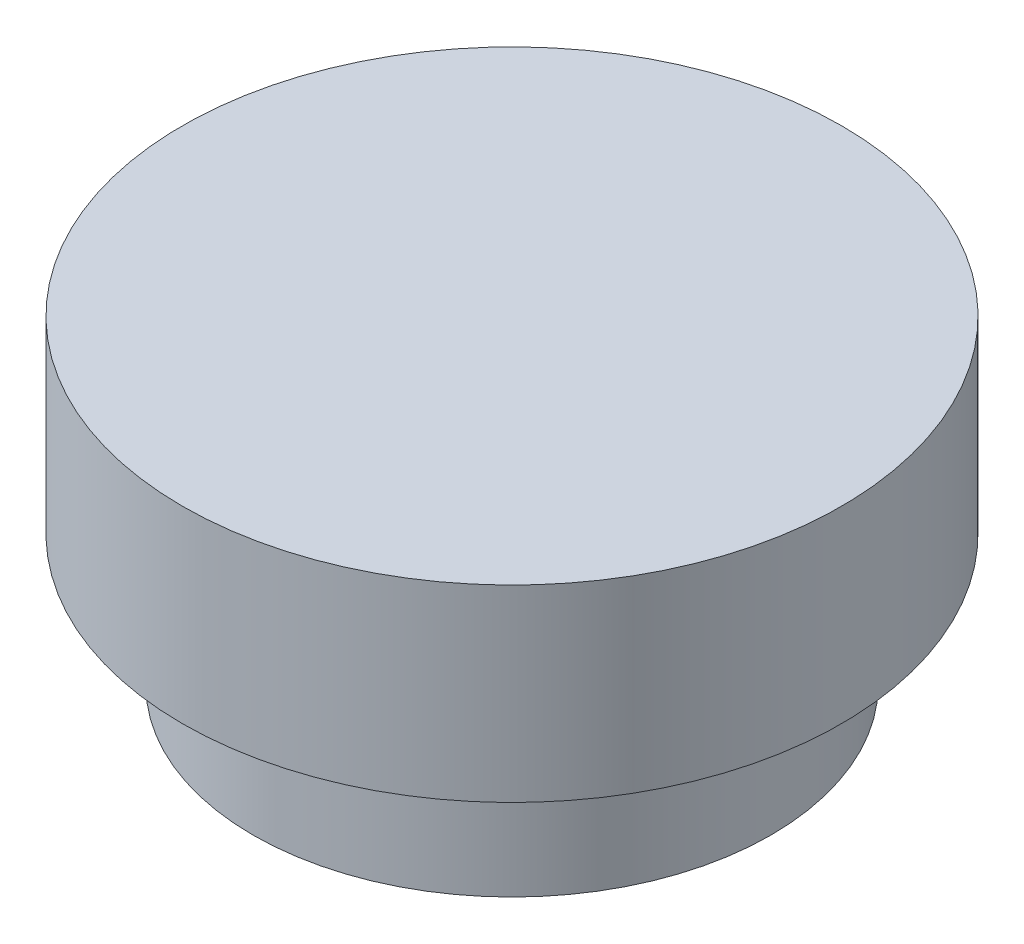
ISO-10303-21;
HEADER;
FILE_DESCRIPTION(('STEP AP214'),'2;1');
FILE_NAME('part.step','',(''),(''),'','','');
FILE_SCHEMA(('AUTOMOTIVE_DESIGN { 1 0 10303 214 1 1 1 1 }'));
ENDSEC;
DATA;
#1=APPLICATION_CONTEXT('core data for automotive mechanical design processes');
#2=APPLICATION_PROTOCOL_DEFINITION('international standard','automotive_design',2000,#1);
#3=PRODUCT_CONTEXT('',#1,'mechanical');
#4=PRODUCT('Part','Part','',(#3));
#5=PRODUCT_RELATED_PRODUCT_CATEGORY('part','',(#4));
#6=PRODUCT_DEFINITION_FORMATION('','',#4);
#7=PRODUCT_DEFINITION_CONTEXT('part definition',#1,'design');
#8=PRODUCT_DEFINITION('design','',#6,#7);
#9=PRODUCT_DEFINITION_SHAPE('','',#8);
#10=(LENGTH_UNIT() NAMED_UNIT(*) SI_UNIT(.MILLI.,.METRE.));
#11=(NAMED_UNIT(*) PLANE_ANGLE_UNIT() SI_UNIT($,.RADIAN.));
#12=(NAMED_UNIT(*) SI_UNIT($,.STERADIAN.) SOLID_ANGLE_UNIT());
#13=UNCERTAINTY_MEASURE_WITH_UNIT(LENGTH_MEASURE(1.E-05),#10,'distance_accuracy_value','');
#14=(GEOMETRIC_REPRESENTATION_CONTEXT(3) GLOBAL_UNCERTAINTY_ASSIGNED_CONTEXT((#13)) GLOBAL_UNIT_ASSIGNED_CONTEXT((#10,
#11,#12)) REPRESENTATION_CONTEXT('',''));
#15=CARTESIAN_POINT('',(0.,0.,0.));
#16=DIRECTION('',(0.,0.,1.));
#17=DIRECTION('',(1.,0.,0.));
#18=AXIS2_PLACEMENT_3D('',#15,#16,#17);
#19=CARTESIAN_POINT('',(0.,2.5,0.));
#20=DIRECTION('',(0.,-1.,0.));
#21=DIRECTION('',(0.,0.,-1.));
#22=AXIS2_PLACEMENT_3D('',#19,#20,#21);
#23=CYLINDRICAL_SURFACE('',#22,1.25);
#24=CARTESIAN_POINT('',(0.,2.5,0.));
#25=DIRECTION('',(0.,1.,0.));
#26=DIRECTION('',(0.,0.,1.));
#27=AXIS2_PLACEMENT_3D('',#24,#25,#26);
#28=CIRCLE('',#27,1.25);
#29=CARTESIAN_POINT('',(0.,2.5,1.25));
#30=VERTEX_POINT('',#29);
#31=EDGE_CURVE('E10',#30,#30,#28,.T.);
#32=ORIENTED_EDGE('',*,*,#31,.F.);
#33=EDGE_LOOP('',(#32));
#34=FACE_BOUND('',#33,.T.);
#35=CARTESIAN_POINT('',(0.,0.,0.));
#36=DIRECTION('',(0.,1.,0.));
#37=DIRECTION('',(0.,0.,1.));
#38=AXIS2_PLACEMENT_3D('',#35,#36,#37);
#39=CIRCLE('',#38,1.25);
#40=CARTESIAN_POINT('',(0.,0.,1.25));
#41=VERTEX_POINT('',#40);
#42=EDGE_CURVE('E36',#41,#41,#39,.T.);
#43=ORIENTED_EDGE('',*,*,#42,.T.);
#44=EDGE_LOOP('',(#43));
#45=FACE_BOUND('',#44,.T.);
#46=ADVANCED_FACE('F33',(#34,#45),#23,.T.);
#47=CARTESIAN_POINT('',(0.,0.,0.));
#48=DIRECTION('',(0.,1.,0.));
#49=DIRECTION('',(0.,0.,1.));
#50=AXIS2_PLACEMENT_3D('',#47,#48,#49);
#51=PLANE('',#50);
#52=ORIENTED_EDGE('',*,*,#42,.F.);
#53=EDGE_LOOP('',(#52));
#54=FACE_BOUND('',#53,.T.);
#55=ADVANCED_FACE('F75',(#54),#51,.F.);
#56=CARTESIAN_POINT('',(0.,6.,0.));
#57=DIRECTION('',(0.,-1.,0.));
#58=DIRECTION('',(0.,0.,-1.));
#59=AXIS2_PLACEMENT_3D('',#56,#57,#58);
#60=CYLINDRICAL_SURFACE('',#59,6.875);
#61=CARTESIAN_POINT('',(0.,6.,0.));
#62=DIRECTION('',(0.,1.,0.));
#63=DIRECTION('',(0.,0.,1.));
#64=AXIS2_PLACEMENT_3D('',#61,#62,#63);
#65=CIRCLE('',#64,6.875);
#66=CARTESIAN_POINT('',(0.,6.,6.875));
#67=VERTEX_POINT('',#66);
#68=EDGE_CURVE('E43',#67,#67,#65,.T.);
#69=ORIENTED_EDGE('',*,*,#68,.F.);
#70=EDGE_LOOP('',(#69));
#71=FACE_BOUND('',#70,.T.);
#72=CARTESIAN_POINT('',(0.,2.5,0.));
#73=DIRECTION('',(0.,1.,0.));
#74=DIRECTION('',(0.,0.,1.));
#75=AXIS2_PLACEMENT_3D('',#72,#73,#74);
#76=CIRCLE('',#75,6.875);
#77=CARTESIAN_POINT('',(0.,2.5,6.875));
#78=VERTEX_POINT('',#77);
#79=EDGE_CURVE('E45',#78,#78,#76,.T.);
#80=ORIENTED_EDGE('',*,*,#79,.T.);
#81=EDGE_LOOP('',(#80));
#82=FACE_BOUND('',#81,.T.);
#83=ADVANCED_FACE('F80',(#71,#82),#60,.T.);
#84=CARTESIAN_POINT('',(0.,2.5,0.));
#85=DIRECTION('',(0.,1.,0.));
#86=DIRECTION('',(0.,0.,1.));
#87=AXIS2_PLACEMENT_3D('',#84,#85,#86);
#88=PLANE('',#87);
#89=ORIENTED_EDGE('',*,*,#31,.T.);
#90=EDGE_LOOP('',(#89));
#91=FACE_BOUND('',#90,.T.);
#92=ORIENTED_EDGE('',*,*,#79,.F.);
#93=EDGE_LOOP('',(#92));
#94=FACE_BOUND('',#93,.T.);
#95=ADVANCED_FACE('F62',(#91,#94),#88,.F.);
#96=CARTESIAN_POINT('',(0.,11.,0.));
#97=DIRECTION('',(0.,-1.,0.));
#98=DIRECTION('',(0.,0.,-1.));
#99=AXIS2_PLACEMENT_3D('',#96,#97,#98);
#100=CYLINDRICAL_SURFACE('',#99,8.75);
#101=CARTESIAN_POINT('',(0.,11.,0.));
#102=DIRECTION('',(0.,1.,0.));
#103=DIRECTION('',(0.,0.,1.));
#104=AXIS2_PLACEMENT_3D('',#101,#102,#103);
#105=CIRCLE('',#104,8.75);
#106=CARTESIAN_POINT('',(0.,11.,8.75));
#107=VERTEX_POINT('',#106);
#108=EDGE_CURVE('E48',#107,#107,#105,.T.);
#109=ORIENTED_EDGE('',*,*,#108,.F.);
#110=EDGE_LOOP('',(#109));
#111=FACE_BOUND('',#110,.T.);
#112=CARTESIAN_POINT('',(0.,6.,0.));
#113=DIRECTION('',(0.,1.,0.));
#114=DIRECTION('',(0.,0.,1.));
#115=AXIS2_PLACEMENT_3D('',#112,#113,#114);
#116=CIRCLE('',#115,8.75);
#117=CARTESIAN_POINT('',(0.,6.,8.75));
#118=VERTEX_POINT('',#117);
#119=EDGE_CURVE('E51',#118,#118,#116,.T.);
#120=ORIENTED_EDGE('',*,*,#119,.T.);
#121=EDGE_LOOP('',(#120));
#122=FACE_BOUND('',#121,.T.);
#123=ADVANCED_FACE('F59',(#111,#122),#100,.T.);
#124=CARTESIAN_POINT('',(0.,11.,0.));
#125=DIRECTION('',(0.,1.,0.));
#126=DIRECTION('',(0.,0.,1.));
#127=AXIS2_PLACEMENT_3D('',#124,#125,#126);
#128=PLANE('',#127);
#129=ORIENTED_EDGE('',*,*,#108,.T.);
#130=EDGE_LOOP('',(#129));
#131=FACE_BOUND('',#130,.T.);
#132=ADVANCED_FACE('F57',(#131),#128,.T.);
#133=CARTESIAN_POINT('',(0.,6.,0.));
#134=DIRECTION('',(0.,1.,0.));
#135=DIRECTION('',(0.,0.,1.));
#136=AXIS2_PLACEMENT_3D('',#133,#134,#135);
#137=PLANE('',#136);
#138=ORIENTED_EDGE('',*,*,#68,.T.);
#139=EDGE_LOOP('',(#138));
#140=FACE_BOUND('',#139,.T.);
#141=ORIENTED_EDGE('',*,*,#119,.F.);
#142=EDGE_LOOP('',(#141));
#143=FACE_BOUND('',#142,.T.);
#144=ADVANCED_FACE('F66',(#140,#143),#137,.F.);
#145=CLOSED_SHELL('',(#46,#55,#83,#95,#123,#132,#144));
#146=MANIFOLD_SOLID_BREP('B2',#145);
#147=ADVANCED_BREP_SHAPE_REPRESENTATION('',(#18,#146),#14);
#148=SHAPE_DEFINITION_REPRESENTATION(#9,#147);
ENDSEC;
END-ISO-10303-21;
